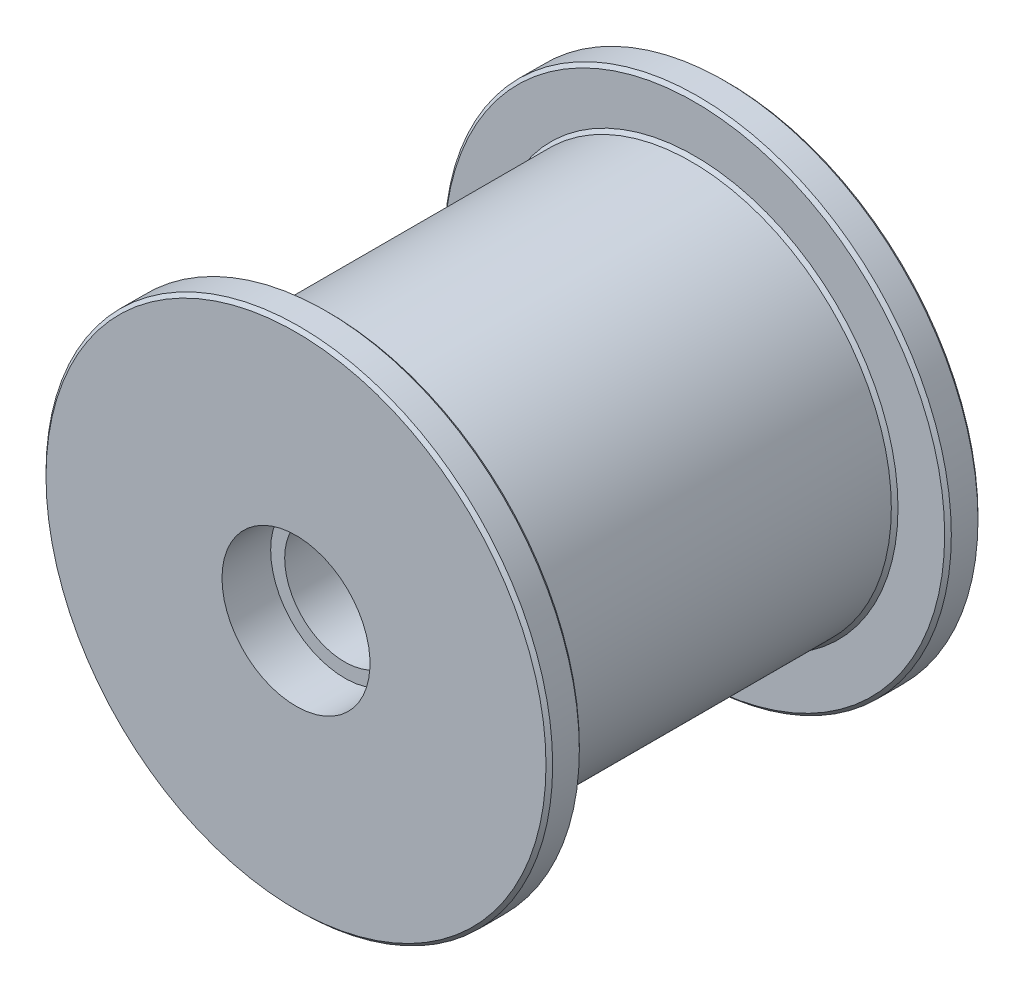
ISO-10303-21;
HEADER;
FILE_DESCRIPTION(('STEP AP214'),'2;1');
FILE_NAME('part.step','',(''),(''),'','','');
FILE_SCHEMA(('AUTOMOTIVE_DESIGN { 1 0 10303 214 1 1 1 1 }'));
ENDSEC;
DATA;
#1=APPLICATION_CONTEXT('core data for automotive mechanical design processes');
#2=APPLICATION_PROTOCOL_DEFINITION('international standard','automotive_design',2000,#1);
#3=PRODUCT_CONTEXT('',#1,'mechanical');
#4=PRODUCT('Part','Part','',(#3));
#5=PRODUCT_RELATED_PRODUCT_CATEGORY('part','',(#4));
#6=PRODUCT_DEFINITION_FORMATION('','',#4);
#7=PRODUCT_DEFINITION_CONTEXT('part definition',#1,'design');
#8=PRODUCT_DEFINITION('design','',#6,#7);
#9=PRODUCT_DEFINITION_SHAPE('','',#8);
#10=(LENGTH_UNIT() NAMED_UNIT(*) SI_UNIT(.MILLI.,.METRE.));
#11=(NAMED_UNIT(*) PLANE_ANGLE_UNIT() SI_UNIT($,.RADIAN.));
#12=(NAMED_UNIT(*) SI_UNIT($,.STERADIAN.) SOLID_ANGLE_UNIT());
#13=UNCERTAINTY_MEASURE_WITH_UNIT(LENGTH_MEASURE(1.E-05),#10,'distance_accuracy_value','');
#14=(GEOMETRIC_REPRESENTATION_CONTEXT(3) GLOBAL_UNCERTAINTY_ASSIGNED_CONTEXT((#13)) GLOBAL_UNIT_ASSIGNED_CONTEXT((#10,
#11,#12)) REPRESENTATION_CONTEXT('',''));
#15=CARTESIAN_POINT('',(0.,0.,0.));
#16=DIRECTION('',(0.,0.,1.));
#17=DIRECTION('',(1.,0.,0.));
#18=AXIS2_PLACEMENT_3D('',#15,#16,#17);
#19=CARTESIAN_POINT('',(-38.0000000000001,0.,0.));
#20=DIRECTION('',(0.,0.,-1.));
#21=DIRECTION('',(-1.,0.,0.));
#22=AXIS2_PLACEMENT_3D('',#19,#20,#21);
#23=PLANE('',#22);
#24=CARTESIAN_POINT('',(0.,0.,0.));
#25=DIRECTION('',(0.,0.,-1.));
#26=DIRECTION('',(-1.,0.,0.));
#27=AXIS2_PLACEMENT_3D('',#24,#25,#26);
#28=CIRCLE('',#27,37.5000000000001);
#29=CARTESIAN_POINT('',(-37.5000000000001,0.,0.));
#30=VERTEX_POINT('',#29);
#31=EDGE_CURVE('E73',#30,#30,#28,.F.);
#32=ORIENTED_EDGE('',*,*,#31,.T.);
#33=EDGE_LOOP('',(#32));
#34=FACE_BOUND('',#33,.T.);
#35=CARTESIAN_POINT('',(0.,0.,0.));
#36=DIRECTION('',(0.,0.,-1.));
#37=DIRECTION('',(-1.,0.,0.));
#38=AXIS2_PLACEMENT_3D('',#35,#36,#37);
#39=CIRCLE('',#38,11.1);
#40=CARTESIAN_POINT('',(-11.1,0.,0.));
#41=VERTEX_POINT('',#40);
#42=EDGE_CURVE('E91',#41,#41,#39,.T.);
#43=ORIENTED_EDGE('',*,*,#42,.T.);
#44=EDGE_LOOP('',(#43));
#45=FACE_BOUND('',#44,.T.);
#46=ADVANCED_FACE('F32',(#34,#45),#23,.F.);
#47=CARTESIAN_POINT('',(0.,0.,-64.8));
#48=DIRECTION('',(0.,0.,1.));
#49=DIRECTION('',(1.,0.,0.));
#50=AXIS2_PLACEMENT_3D('',#47,#48,#49);
#51=PLANE('',#50);
#52=CARTESIAN_POINT('',(0.,0.,-64.8));
#53=DIRECTION('',(0.,0.,1.));
#54=DIRECTION('',(1.,0.,0.));
#55=AXIS2_PLACEMENT_3D('',#52,#53,#54);
#56=CIRCLE('',#55,37.5);
#57=CARTESIAN_POINT('',(37.5,0.,-64.8));
#58=VERTEX_POINT('',#57);
#59=EDGE_CURVE('E10',#58,#58,#56,.F.);
#60=ORIENTED_EDGE('',*,*,#59,.T.);
#61=EDGE_LOOP('',(#60));
#62=FACE_BOUND('',#61,.T.);
#63=CARTESIAN_POINT('',(0.,0.,-64.8));
#64=DIRECTION('',(0.,0.,-1.));
#65=DIRECTION('',(-1.,0.,0.));
#66=AXIS2_PLACEMENT_3D('',#63,#64,#65);
#67=CIRCLE('',#66,11.1);
#68=CARTESIAN_POINT('',(-11.1,0.,-64.8));
#69=VERTEX_POINT('',#68);
#70=EDGE_CURVE('E76',#69,#69,#67,.T.);
#71=ORIENTED_EDGE('',*,*,#70,.F.);
#72=EDGE_LOOP('',(#71));
#73=FACE_BOUND('',#72,.T.);
#74=ADVANCED_FACE('F128',(#62,#73),#51,.F.);
#75=CARTESIAN_POINT('',(0.,0.,0.));
#76=DIRECTION('',(0.,0.,1.));
#77=DIRECTION('',(1.,0.,0.));
#78=AXIS2_PLACEMENT_3D('',#75,#76,#77);
#79=CYLINDRICAL_SURFACE('',#78,38.);
#80=CARTESIAN_POINT('',(0.,0.,-60.3));
#81=DIRECTION('',(0.,0.,-1.));
#82=DIRECTION('',(-1.,0.,0.));
#83=AXIS2_PLACEMENT_3D('',#80,#81,#82);
#84=CIRCLE('',#83,38.);
#85=CARTESIAN_POINT('',(-38.,0.,-60.3));
#86=VERTEX_POINT('',#85);
#87=EDGE_CURVE('E39',#86,#86,#84,.T.);
#88=ORIENTED_EDGE('',*,*,#87,.T.);
#89=EDGE_LOOP('',(#88));
#90=FACE_BOUND('',#89,.T.);
#91=CARTESIAN_POINT('',(0.,0.,-64.3));
#92=DIRECTION('',(0.,0.,1.));
#93=DIRECTION('',(1.,0.,0.));
#94=AXIS2_PLACEMENT_3D('',#91,#92,#93);
#95=CIRCLE('',#94,38.);
#96=CARTESIAN_POINT('',(38.,0.,-64.3));
#97=VERTEX_POINT('',#96);
#98=EDGE_CURVE('E43',#97,#97,#95,.T.);
#99=ORIENTED_EDGE('',*,*,#98,.T.);
#100=EDGE_LOOP('',(#99));
#101=FACE_BOUND('',#100,.T.);
#102=ADVANCED_FACE('F130',(#90,#101),#79,.T.);
#103=CARTESIAN_POINT('',(-30.,0.,-59.8));
#104=DIRECTION('',(0.,0.,-1.));
#105=DIRECTION('',(-1.,0.,0.));
#106=AXIS2_PLACEMENT_3D('',#103,#104,#105);
#107=PLANE('',#106);
#108=CARTESIAN_POINT('',(0.,0.,-59.8));
#109=DIRECTION('',(0.,0.,-1.));
#110=DIRECTION('',(-1.,0.,0.));
#111=AXIS2_PLACEMENT_3D('',#108,#109,#110);
#112=CIRCLE('',#111,30.5);
#113=CARTESIAN_POINT('',(-30.5,0.,-59.8));
#114=VERTEX_POINT('',#113);
#115=EDGE_CURVE('E47',#114,#114,#112,.T.);
#116=ORIENTED_EDGE('',*,*,#115,.T.);
#117=EDGE_LOOP('',(#116));
#118=FACE_BOUND('',#117,.T.);
#119=CARTESIAN_POINT('',(0.,0.,-59.8));
#120=DIRECTION('',(0.,0.,-1.));
#121=DIRECTION('',(-1.,0.,0.));
#122=AXIS2_PLACEMENT_3D('',#119,#120,#121);
#123=CIRCLE('',#122,37.4999999999999);
#124=CARTESIAN_POINT('',(-37.4999999999999,0.,-59.8));
#125=VERTEX_POINT('',#124);
#126=EDGE_CURVE('E52',#125,#125,#123,.F.);
#127=ORIENTED_EDGE('',*,*,#126,.T.);
#128=EDGE_LOOP('',(#127));
#129=FACE_BOUND('',#128,.T.);
#130=ADVANCED_FACE('F136',(#118,#129),#107,.F.);
#131=CARTESIAN_POINT('',(0.,0.,0.));
#132=DIRECTION('',(0.,0.,1.));
#133=DIRECTION('',(1.,0.,0.));
#134=AXIS2_PLACEMENT_3D('',#131,#132,#133);
#135=CYLINDRICAL_SURFACE('',#134,30.);
#136=CARTESIAN_POINT('',(0.,0.,-5.49999999999999));
#137=DIRECTION('',(0.,0.,1.));
#138=DIRECTION('',(1.,0.,0.));
#139=AXIS2_PLACEMENT_3D('',#136,#137,#138);
#140=CIRCLE('',#139,30.);
#141=CARTESIAN_POINT('',(30.,0.,-5.49999999999999));
#142=VERTEX_POINT('',#141);
#143=EDGE_CURVE('E55',#142,#142,#140,.F.);
#144=ORIENTED_EDGE('',*,*,#143,.T.);
#145=EDGE_LOOP('',(#144));
#146=FACE_BOUND('',#145,.T.);
#147=CARTESIAN_POINT('',(0.,0.,-59.3));
#148=DIRECTION('',(0.,0.,-1.));
#149=DIRECTION('',(-1.,0.,0.));
#150=AXIS2_PLACEMENT_3D('',#147,#148,#149);
#151=CIRCLE('',#150,30.);
#152=CARTESIAN_POINT('',(-30.,0.,-59.3));
#153=VERTEX_POINT('',#152);
#154=EDGE_CURVE('E58',#153,#153,#151,.F.);
#155=ORIENTED_EDGE('',*,*,#154,.T.);
#156=EDGE_LOOP('',(#155));
#157=FACE_BOUND('',#156,.T.);
#158=ADVANCED_FACE('F167',(#146,#157),#135,.T.);
#159=CARTESIAN_POINT('',(-30.,0.,-5.));
#160=DIRECTION('',(0.,0.,1.));
#161=DIRECTION('',(1.,0.,0.));
#162=AXIS2_PLACEMENT_3D('',#159,#160,#161);
#163=PLANE('',#162);
#164=CARTESIAN_POINT('',(0.,0.,-5.));
#165=DIRECTION('',(0.,0.,1.));
#166=DIRECTION('',(1.,0.,0.));
#167=AXIS2_PLACEMENT_3D('',#164,#165,#166);
#168=CIRCLE('',#167,37.5);
#169=CARTESIAN_POINT('',(37.5,0.,-5.));
#170=VERTEX_POINT('',#169);
#171=EDGE_CURVE('E61',#170,#170,#168,.F.);
#172=ORIENTED_EDGE('',*,*,#171,.T.);
#173=EDGE_LOOP('',(#172));
#174=FACE_BOUND('',#173,.T.);
#175=CARTESIAN_POINT('',(0.,0.,-5.));
#176=DIRECTION('',(0.,0.,1.));
#177=DIRECTION('',(1.,0.,0.));
#178=AXIS2_PLACEMENT_3D('',#175,#176,#177);
#179=CIRCLE('',#178,30.5);
#180=CARTESIAN_POINT('',(30.5,0.,-5.));
#181=VERTEX_POINT('',#180);
#182=EDGE_CURVE('E64',#181,#181,#179,.T.);
#183=ORIENTED_EDGE('',*,*,#182,.T.);
#184=EDGE_LOOP('',(#183));
#185=FACE_BOUND('',#184,.T.);
#186=ADVANCED_FACE('F172',(#174,#185),#163,.F.);
#187=CARTESIAN_POINT('',(0.,0.,0.));
#188=DIRECTION('',(0.,0.,1.));
#189=DIRECTION('',(1.,0.,0.));
#190=AXIS2_PLACEMENT_3D('',#187,#188,#189);
#191=CYLINDRICAL_SURFACE('',#190,38.);
#192=CARTESIAN_POINT('',(0.,0.,-0.499999999999959));
#193=DIRECTION('',(0.,0.,-1.));
#194=DIRECTION('',(-1.,0.,0.));
#195=AXIS2_PLACEMENT_3D('',#192,#193,#194);
#196=CIRCLE('',#195,38.);
#197=CARTESIAN_POINT('',(-38.,0.,-0.499999999999959));
#198=VERTEX_POINT('',#197);
#199=EDGE_CURVE('E67',#198,#198,#196,.T.);
#200=ORIENTED_EDGE('',*,*,#199,.T.);
#201=EDGE_LOOP('',(#200));
#202=FACE_BOUND('',#201,.T.);
#203=CARTESIAN_POINT('',(0.,0.,-4.49999999999996));
#204=DIRECTION('',(0.,0.,1.));
#205=DIRECTION('',(1.,0.,0.));
#206=AXIS2_PLACEMENT_3D('',#203,#204,#205);
#207=CIRCLE('',#206,38.);
#208=CARTESIAN_POINT('',(38.,0.,-4.49999999999996));
#209=VERTEX_POINT('',#208);
#210=EDGE_CURVE('E70',#209,#209,#207,.T.);
#211=ORIENTED_EDGE('',*,*,#210,.T.);
#212=EDGE_LOOP('',(#211));
#213=FACE_BOUND('',#212,.T.);
#214=ADVANCED_FACE('F124',(#202,#213),#191,.T.);
#215=CARTESIAN_POINT('',(0.,0.,-64.8));
#216=DIRECTION('',(0.,0.,-1.));
#217=DIRECTION('',(-1.,0.,0.));
#218=AXIS2_PLACEMENT_3D('',#215,#216,#217);
#219=CYLINDRICAL_SURFACE('',#218,11.1);
#220=CARTESIAN_POINT('',(0.,0.,-57.5));
#221=DIRECTION('',(0.,0.,-1.));
#222=DIRECTION('',(-1.,0.,0.));
#223=AXIS2_PLACEMENT_3D('',#220,#221,#222);
#224=CIRCLE('',#223,11.1);
#225=CARTESIAN_POINT('',(-11.1,0.,-57.5));
#226=VERTEX_POINT('',#225);
#227=EDGE_CURVE('E79',#226,#226,#224,.T.);
#228=ORIENTED_EDGE('',*,*,#227,.F.);
#229=EDGE_LOOP('',(#228));
#230=FACE_BOUND('',#229,.T.);
#231=ORIENTED_EDGE('',*,*,#70,.T.);
#232=EDGE_LOOP('',(#231));
#233=FACE_BOUND('',#232,.T.);
#234=ADVANCED_FACE('F118',(#230,#233),#219,.F.);
#235=CARTESIAN_POINT('',(-11.1,0.,-57.5));
#236=DIRECTION('',(0.,0.,1.));
#237=DIRECTION('',(1.,0.,0.));
#238=AXIS2_PLACEMENT_3D('',#235,#236,#237);
#239=PLANE('',#238);
#240=CARTESIAN_POINT('',(0.,0.,-57.5));
#241=DIRECTION('',(0.,0.,-1.));
#242=DIRECTION('',(-1.,0.,0.));
#243=AXIS2_PLACEMENT_3D('',#240,#241,#242);
#244=CIRCLE('',#243,9.);
#245=CARTESIAN_POINT('',(-9.,0.,-57.5));
#246=VERTEX_POINT('',#245);
#247=EDGE_CURVE('E82',#246,#246,#244,.T.);
#248=ORIENTED_EDGE('',*,*,#247,.F.);
#249=EDGE_LOOP('',(#248));
#250=FACE_BOUND('',#249,.T.);
#251=ORIENTED_EDGE('',*,*,#227,.T.);
#252=EDGE_LOOP('',(#251));
#253=FACE_BOUND('',#252,.T.);
#254=ADVANCED_FACE('F112',(#250,#253),#239,.F.);
#255=CARTESIAN_POINT('',(0.,0.,-64.8));
#256=DIRECTION('',(0.,0.,-1.));
#257=DIRECTION('',(-1.,0.,0.));
#258=AXIS2_PLACEMENT_3D('',#255,#256,#257);
#259=CYLINDRICAL_SURFACE('',#258,9.);
#260=CARTESIAN_POINT('',(0.,0.,-7.3));
#261=DIRECTION('',(0.,0.,-1.));
#262=DIRECTION('',(-1.,0.,0.));
#263=AXIS2_PLACEMENT_3D('',#260,#261,#262);
#264=CIRCLE('',#263,9.);
#265=CARTESIAN_POINT('',(-9.,0.,-7.3));
#266=VERTEX_POINT('',#265);
#267=EDGE_CURVE('E85',#266,#266,#264,.T.);
#268=ORIENTED_EDGE('',*,*,#267,.F.);
#269=EDGE_LOOP('',(#268));
#270=FACE_BOUND('',#269,.T.);
#271=ORIENTED_EDGE('',*,*,#247,.T.);
#272=EDGE_LOOP('',(#271));
#273=FACE_BOUND('',#272,.T.);
#274=ADVANCED_FACE('F106',(#270,#273),#259,.F.);
#275=CARTESIAN_POINT('',(-9.,0.,-7.3));
#276=DIRECTION('',(0.,0.,-1.));
#277=DIRECTION('',(-1.,0.,0.));
#278=AXIS2_PLACEMENT_3D('',#275,#276,#277);
#279=PLANE('',#278);
#280=CARTESIAN_POINT('',(0.,0.,-7.3));
#281=DIRECTION('',(0.,0.,-1.));
#282=DIRECTION('',(-1.,0.,0.));
#283=AXIS2_PLACEMENT_3D('',#280,#281,#282);
#284=CIRCLE('',#283,11.1);
#285=CARTESIAN_POINT('',(-11.1,0.,-7.3));
#286=VERTEX_POINT('',#285);
#287=EDGE_CURVE('E88',#286,#286,#284,.T.);
#288=ORIENTED_EDGE('',*,*,#287,.F.);
#289=EDGE_LOOP('',(#288));
#290=FACE_BOUND('',#289,.T.);
#291=ORIENTED_EDGE('',*,*,#267,.T.);
#292=EDGE_LOOP('',(#291));
#293=FACE_BOUND('',#292,.T.);
#294=ADVANCED_FACE('F100',(#290,#293),#279,.F.);
#295=CARTESIAN_POINT('',(0.,0.,-64.8));
#296=DIRECTION('',(0.,0.,-1.));
#297=DIRECTION('',(-1.,0.,0.));
#298=AXIS2_PLACEMENT_3D('',#295,#296,#297);
#299=CYLINDRICAL_SURFACE('',#298,11.1);
#300=ORIENTED_EDGE('',*,*,#42,.F.);
#301=EDGE_LOOP('',(#300));
#302=FACE_BOUND('',#301,.T.);
#303=ORIENTED_EDGE('',*,*,#287,.T.);
#304=EDGE_LOOP('',(#303));
#305=FACE_BOUND('',#304,.T.);
#306=ADVANCED_FACE('F96',(#302,#305),#299,.F.);
#307=CARTESIAN_POINT('',(0.,0.,0.));
#308=DIRECTION('',(0.,0.,-1.));
#309=DIRECTION('',(-1.,0.,0.));
#310=AXIS2_PLACEMENT_3D('',#307,#308,#309);
#311=CONICAL_SURFACE('',#310,37.5000000000001,0.785398163397441);
#312=ORIENTED_EDGE('',*,*,#199,.F.);
#313=EDGE_LOOP('',(#312));
#314=FACE_BOUND('',#313,.T.);
#315=ORIENTED_EDGE('',*,*,#31,.F.);
#316=EDGE_LOOP('',(#315));
#317=FACE_BOUND('',#316,.T.);
#318=ADVANCED_FACE('F99',(#314,#317),#311,.T.);
#319=CARTESIAN_POINT('',(0.,0.,-4.49999999999996));
#320=DIRECTION('',(0.,0.,1.));
#321=DIRECTION('',(1.,0.,0.));
#322=AXIS2_PLACEMENT_3D('',#319,#320,#321);
#323=CONICAL_SURFACE('',#322,38.,0.785398163397455);
#324=ORIENTED_EDGE('',*,*,#171,.F.);
#325=EDGE_LOOP('',(#324));
#326=FACE_BOUND('',#325,.T.);
#327=ORIENTED_EDGE('',*,*,#210,.F.);
#328=EDGE_LOOP('',(#327));
#329=FACE_BOUND('',#328,.T.);
#330=ADVANCED_FACE('F144',(#326,#329),#323,.T.);
#331=CARTESIAN_POINT('',(0.,0.,-5.));
#332=DIRECTION('',(0.,0.,1.));
#333=DIRECTION('',(1.,0.,0.));
#334=AXIS2_PLACEMENT_3D('',#331,#332,#333);
#335=CONICAL_SURFACE('',#334,30.5,0.785398163397473);
#336=ORIENTED_EDGE('',*,*,#143,.F.);
#337=EDGE_LOOP('',(#336));
#338=FACE_BOUND('',#337,.T.);
#339=ORIENTED_EDGE('',*,*,#182,.F.);
#340=EDGE_LOOP('',(#339));
#341=FACE_BOUND('',#340,.T.);
#342=ADVANCED_FACE('F148',(#338,#341),#335,.T.);
#343=CARTESIAN_POINT('',(0.,0.,-59.3));
#344=DIRECTION('',(0.,0.,-1.));
#345=DIRECTION('',(-1.,0.,0.));
#346=AXIS2_PLACEMENT_3D('',#343,#344,#345);
#347=CONICAL_SURFACE('',#346,30.,0.785398163397438);
#348=ORIENTED_EDGE('',*,*,#115,.F.);
#349=EDGE_LOOP('',(#348));
#350=FACE_BOUND('',#349,.T.);
#351=ORIENTED_EDGE('',*,*,#154,.F.);
#352=EDGE_LOOP('',(#351));
#353=FACE_BOUND('',#352,.T.);
#354=ADVANCED_FACE('F152',(#350,#353),#347,.T.);
#355=CARTESIAN_POINT('',(0.,0.,-59.8));
#356=DIRECTION('',(0.,0.,-1.));
#357=DIRECTION('',(-1.,0.,0.));
#358=AXIS2_PLACEMENT_3D('',#355,#356,#357);
#359=CONICAL_SURFACE('',#358,37.4999999999999,0.785398163397483);
#360=ORIENTED_EDGE('',*,*,#87,.F.);
#361=EDGE_LOOP('',(#360));
#362=FACE_BOUND('',#361,.T.);
#363=ORIENTED_EDGE('',*,*,#126,.F.);
#364=EDGE_LOOP('',(#363));
#365=FACE_BOUND('',#364,.T.);
#366=ADVANCED_FACE('F155',(#362,#365),#359,.T.);
#367=CARTESIAN_POINT('',(0.,0.,-64.3));
#368=DIRECTION('',(0.,0.,1.));
#369=DIRECTION('',(1.,0.,0.));
#370=AXIS2_PLACEMENT_3D('',#367,#368,#369);
#371=CONICAL_SURFACE('',#370,38.,0.785398163397441);
#372=ORIENTED_EDGE('',*,*,#59,.F.);
#373=EDGE_LOOP('',(#372));
#374=FACE_BOUND('',#373,.T.);
#375=ORIENTED_EDGE('',*,*,#98,.F.);
#376=EDGE_LOOP('',(#375));
#377=FACE_BOUND('',#376,.T.);
#378=ADVANCED_FACE('F34',(#374,#377),#371,.T.);
#379=CLOSED_SHELL('',(#46,#74,#102,#130,#158,#186,#214,#234,#254,#274,#294,#306,#318,#330,#342,
#354,#366,#378));
#380=MANIFOLD_SOLID_BREP('B2',#379);
#381=ADVANCED_BREP_SHAPE_REPRESENTATION('',(#18,#380),#14);
#382=SHAPE_DEFINITION_REPRESENTATION(#9,#381);
ENDSEC;
END-ISO-10303-21;
